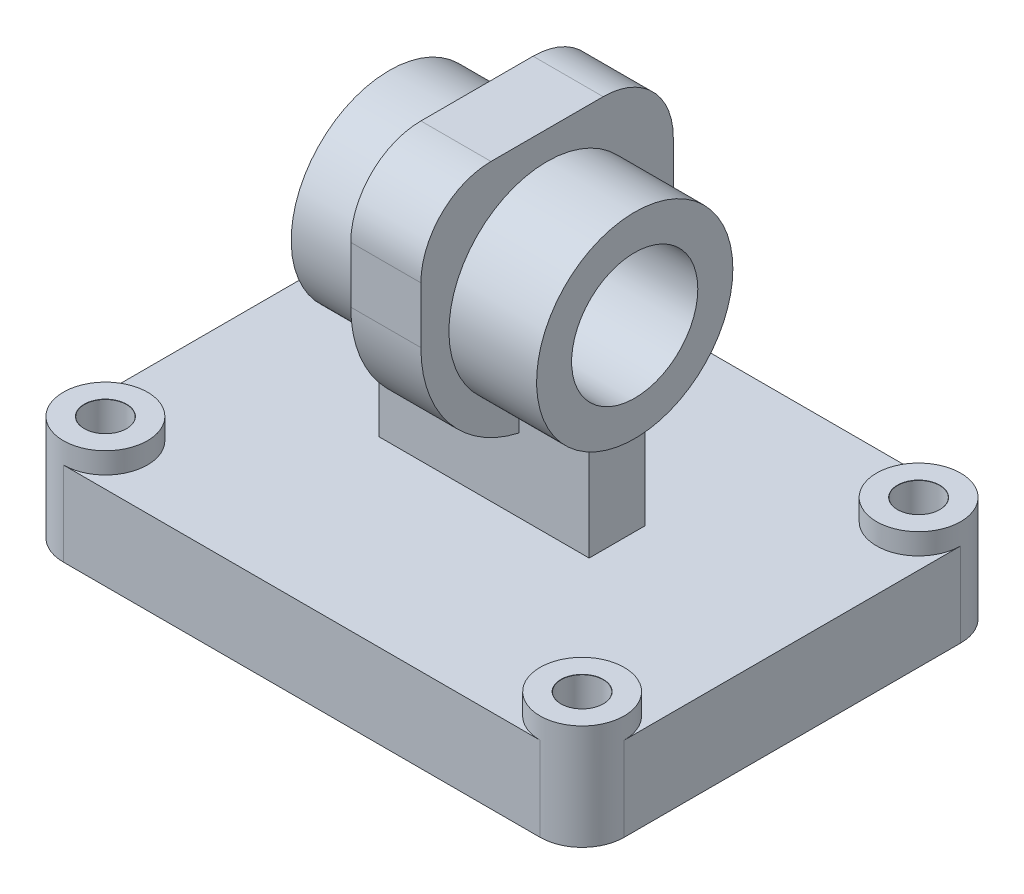
ISO-10303-21;
HEADER;
FILE_DESCRIPTION(('STEP AP214'),'2;1');
FILE_NAME('part.step','',(''),(''),'','','');
FILE_SCHEMA(('AUTOMOTIVE_DESIGN { 1 0 10303 214 1 1 1 1 }'));
ENDSEC;
DATA;
#1=APPLICATION_CONTEXT('core data for automotive mechanical design processes');
#2=APPLICATION_PROTOCOL_DEFINITION('international standard','automotive_design',2000,#1);
#3=PRODUCT_CONTEXT('',#1,'mechanical');
#4=PRODUCT('Part','Part','',(#3));
#5=PRODUCT_RELATED_PRODUCT_CATEGORY('part','',(#4));
#6=PRODUCT_DEFINITION_FORMATION('','',#4);
#7=PRODUCT_DEFINITION_CONTEXT('part definition',#1,'design');
#8=PRODUCT_DEFINITION('design','',#6,#7);
#9=PRODUCT_DEFINITION_SHAPE('','',#8);
#10=(LENGTH_UNIT() NAMED_UNIT(*) SI_UNIT(.MILLI.,.METRE.));
#11=(NAMED_UNIT(*) PLANE_ANGLE_UNIT() SI_UNIT($,.RADIAN.));
#12=(NAMED_UNIT(*) SI_UNIT($,.STERADIAN.) SOLID_ANGLE_UNIT());
#13=UNCERTAINTY_MEASURE_WITH_UNIT(LENGTH_MEASURE(1.E-05),#10,'distance_accuracy_value','');
#14=(GEOMETRIC_REPRESENTATION_CONTEXT(3) GLOBAL_UNCERTAINTY_ASSIGNED_CONTEXT((#13)) GLOBAL_UNIT_ASSIGNED_CONTEXT((#10,
#11,#12)) REPRESENTATION_CONTEXT('',''));
#15=CARTESIAN_POINT('',(0.,0.,0.));
#16=DIRECTION('',(0.,0.,1.));
#17=DIRECTION('',(1.,0.,0.));
#18=AXIS2_PLACEMENT_3D('',#15,#16,#17);
#19=CARTESIAN_POINT('',(-34.,12.,24.));
#20=DIRECTION('',(0.,1.,0.));
#21=DIRECTION('',(0.,0.,1.));
#22=AXIS2_PLACEMENT_3D('',#19,#20,#21);
#23=PLANE('',#22);
#24=DIRECTION('',(1.,0.,0.));
#25=VECTOR('',#24,1.);
#26=CARTESIAN_POINT('',(-33.9999999999999,12.,30.));
#27=LINE('',#26,#25);
#28=CARTESIAN_POINT('',(-33.9999999999999,12.,30.));
#29=VERTEX_POINT('',#28);
#30=CARTESIAN_POINT('',(34.,12.,30.));
#31=VERTEX_POINT('',#30);
#32=EDGE_CURVE('E395',#29,#31,#27,.T.);
#33=ORIENTED_EDGE('',*,*,#32,.T.);
#34=CARTESIAN_POINT('',(34.,12.,24.));
#35=DIRECTION('',(0.,1.,0.));
#36=DIRECTION('',(0.,0.,1.));
#37=AXIS2_PLACEMENT_3D('',#34,#35,#36);
#38=CIRCLE('',#37,5.99999999999999);
#39=CARTESIAN_POINT('',(40.,12.,24.));
#40=VERTEX_POINT('',#39);
#41=EDGE_CURVE('E467',#31,#40,#38,.F.);
#42=ORIENTED_EDGE('',*,*,#41,.T.);
#43=DIRECTION('',(0.,0.,-1.));
#44=VECTOR('',#43,1.);
#45=CARTESIAN_POINT('',(40.,12.,-23.9999999999999));
#46=LINE('',#45,#44);
#47=CARTESIAN_POINT('',(40.,12.,-24.));
#48=VERTEX_POINT('',#47);
#49=EDGE_CURVE('E398',#40,#48,#46,.T.);
#50=ORIENTED_EDGE('',*,*,#49,.T.);
#51=CARTESIAN_POINT('',(34.,12.,-24.));
#52=DIRECTION('',(0.,1.,0.));
#53=DIRECTION('',(0.,0.,1.));
#54=AXIS2_PLACEMENT_3D('',#51,#52,#53);
#55=CIRCLE('',#54,6.00000000000001);
#56=CARTESIAN_POINT('',(34.,12.,-30.));
#57=VERTEX_POINT('',#56);
#58=EDGE_CURVE('E393',#48,#57,#55,.F.);
#59=ORIENTED_EDGE('',*,*,#58,.T.);
#60=DIRECTION('',(-1.,0.,0.));
#61=VECTOR('',#60,1.);
#62=CARTESIAN_POINT('',(-33.9999999999999,12.,-30.));
#63=LINE('',#62,#61);
#64=CARTESIAN_POINT('',(-34.,12.,-30.));
#65=VERTEX_POINT('',#64);
#66=EDGE_CURVE('E403',#57,#65,#63,.T.);
#67=ORIENTED_EDGE('',*,*,#66,.T.);
#68=CARTESIAN_POINT('',(-34.,12.,-24.));
#69=DIRECTION('',(0.,1.,0.));
#70=DIRECTION('',(0.,0.,1.));
#71=AXIS2_PLACEMENT_3D('',#68,#69,#70);
#72=CIRCLE('',#71,6.);
#73=CARTESIAN_POINT('',(-40.,12.,-23.9999999999999));
#74=VERTEX_POINT('',#73);
#75=EDGE_CURVE('E389',#74,#65,#72,.T.);
#76=ORIENTED_EDGE('',*,*,#75,.F.);
#77=DIRECTION('',(0.,0.,1.));
#78=VECTOR('',#77,1.);
#79=CARTESIAN_POINT('',(-40.,12.,-23.9999999999999));
#80=LINE('',#79,#78);
#81=CARTESIAN_POINT('',(-40.,12.,24.));
#82=VERTEX_POINT('',#81);
#83=EDGE_CURVE('E407',#74,#82,#80,.T.);
#84=ORIENTED_EDGE('',*,*,#83,.T.);
#85=CARTESIAN_POINT('',(-34.,12.,24.));
#86=DIRECTION('',(0.,1.,0.));
#87=DIRECTION('',(0.,0.,1.));
#88=AXIS2_PLACEMENT_3D('',#85,#86,#87);
#89=CIRCLE('',#88,6.);
#90=EDGE_CURVE('E378',#29,#82,#89,.T.);
#91=ORIENTED_EDGE('',*,*,#90,.F.);
#92=EDGE_LOOP('',(#33,#42,#50,#59,#67,#76,#84,#91));
#93=FACE_BOUND('',#92,.T.);
#94=DIRECTION('',(-1.,0.,0.));
#95=VECTOR('',#94,1.);
#96=CARTESIAN_POINT('',(-15.,12.,-4.));
#97=LINE('',#96,#95);
#98=CARTESIAN_POINT('',(15.,12.,-4.));
#99=VERTEX_POINT('',#98);
#100=CARTESIAN_POINT('',(-15.,12.,-4.));
#101=VERTEX_POINT('',#100);
#102=EDGE_CURVE('E256',#99,#101,#97,.T.);
#103=ORIENTED_EDGE('',*,*,#102,.F.);
#104=DIRECTION('',(0.,0.,-1.));
#105=VECTOR('',#104,1.);
#106=CARTESIAN_POINT('',(15.,12.,-4.));
#107=LINE('',#106,#105);
#108=CARTESIAN_POINT('',(15.,12.,4.));
#109=VERTEX_POINT('',#108);
#110=EDGE_CURVE('E250',#109,#99,#107,.T.);
#111=ORIENTED_EDGE('',*,*,#110,.F.);
#112=DIRECTION('',(1.,0.,0.));
#113=VECTOR('',#112,1.);
#114=CARTESIAN_POINT('',(-15.,12.,4.));
#115=LINE('',#114,#113);
#116=CARTESIAN_POINT('',(-15.,12.,4.));
#117=VERTEX_POINT('',#116);
#118=EDGE_CURVE('E255',#117,#109,#115,.T.);
#119=ORIENTED_EDGE('',*,*,#118,.F.);
#120=DIRECTION('',(0.,0.,1.));
#121=VECTOR('',#120,1.);
#122=CARTESIAN_POINT('',(-15.,12.,-4.));
#123=LINE('',#122,#121);
#124=EDGE_CURVE('E260',#101,#117,#123,.T.);
#125=ORIENTED_EDGE('',*,*,#124,.F.);
#126=EDGE_LOOP('',(#103,#111,#119,#125));
#127=FACE_BOUND('',#126,.T.);
#128=ADVANCED_FACE('F45',(#93,#127),#23,.T.);
#129=CARTESIAN_POINT('',(-34.,12.,24.));
#130=DIRECTION('',(0.,-1.,0.));
#131=DIRECTION('',(0.,0.,-1.));
#132=AXIS2_PLACEMENT_3D('',#129,#130,#131);
#133=CYLINDRICAL_SURFACE('',#132,6.);
#134=CARTESIAN_POINT('',(-34.,0.,24.));
#135=DIRECTION('',(0.,1.,0.));
#136=DIRECTION('',(0.,0.,1.));
#137=AXIS2_PLACEMENT_3D('',#134,#135,#136);
#138=CIRCLE('',#137,6.);
#139=CARTESIAN_POINT('',(-40.,0.,24.));
#140=VERTEX_POINT('',#139);
#141=CARTESIAN_POINT('',(-33.9999999999999,0.,30.));
#142=VERTEX_POINT('',#141);
#143=EDGE_CURVE('E388',#140,#142,#138,.T.);
#144=ORIENTED_EDGE('',*,*,#143,.T.);
#145=DIRECTION('',(0.,-1.,0.));
#146=VECTOR('',#145,1.);
#147=CARTESIAN_POINT('',(-33.9999999999999,12.,30.));
#148=LINE('',#147,#146);
#149=EDGE_CURVE('E394',#29,#142,#148,.T.);
#150=ORIENTED_EDGE('',*,*,#149,.F.);
#151=ORIENTED_EDGE('',*,*,#90,.T.);
#152=DIRECTION('',(0.,-1.,0.));
#153=VECTOR('',#152,1.);
#154=CARTESIAN_POINT('',(-40.,12.,24.));
#155=LINE('',#154,#153);
#156=EDGE_CURVE('E411',#82,#140,#155,.T.);
#157=ORIENTED_EDGE('',*,*,#156,.T.);
#158=EDGE_LOOP('',(#144,#150,#151,#157));
#159=FACE_BOUND('',#158,.T.);
#160=CARTESIAN_POINT('',(-34.,15.,24.));
#161=DIRECTION('',(0.,1.,0.));
#162=DIRECTION('',(0.,0.,1.));
#163=AXIS2_PLACEMENT_3D('',#160,#161,#162);
#164=CIRCLE('',#163,6.);
#165=CARTESIAN_POINT('',(-34.,15.,30.));
#166=VERTEX_POINT('',#165);
#167=EDGE_CURVE('E377',#166,#166,#164,.T.);
#168=ORIENTED_EDGE('',*,*,#167,.F.);
#169=EDGE_LOOP('',(#168));
#170=FACE_BOUND('',#169,.T.);
#171=ADVANCED_FACE('F558',(#159,#170),#133,.T.);
#172=CARTESIAN_POINT('',(-33.9999999999999,12.,30.));
#173=DIRECTION('',(0.,0.,-1.));
#174=DIRECTION('',(-1.,0.,0.));
#175=AXIS2_PLACEMENT_3D('',#172,#173,#174);
#176=PLANE('',#175);
#177=DIRECTION('',(1.,0.,0.));
#178=VECTOR('',#177,1.);
#179=CARTESIAN_POINT('',(-33.9999999999999,0.,30.));
#180=LINE('',#179,#178);
#181=CARTESIAN_POINT('',(34.,0.,30.));
#182=VERTEX_POINT('',#181);
#183=EDGE_CURVE('E415',#142,#182,#180,.T.);
#184=ORIENTED_EDGE('',*,*,#183,.T.);
#185=DIRECTION('',(0.,-1.,0.));
#186=VECTOR('',#185,1.);
#187=CARTESIAN_POINT('',(34.,12.,30.));
#188=LINE('',#187,#186);
#189=EDGE_CURVE('E458',#31,#182,#188,.T.);
#190=ORIENTED_EDGE('',*,*,#189,.F.);
#191=ORIENTED_EDGE('',*,*,#32,.F.);
#192=ORIENTED_EDGE('',*,*,#149,.T.);
#193=EDGE_LOOP('',(#184,#190,#191,#192));
#194=FACE_BOUND('',#193,.T.);
#195=ADVANCED_FACE('F564',(#194),#176,.F.);
#196=CARTESIAN_POINT('',(34.,12.,24.));
#197=DIRECTION('',(0.,-1.,0.));
#198=DIRECTION('',(0.,0.,-1.));
#199=AXIS2_PLACEMENT_3D('',#196,#197,#198);
#200=CYLINDRICAL_SURFACE('',#199,6.);
#201=CARTESIAN_POINT('',(34.,0.,24.));
#202=DIRECTION('',(0.,1.,0.));
#203=DIRECTION('',(0.,0.,1.));
#204=AXIS2_PLACEMENT_3D('',#201,#202,#203);
#205=CIRCLE('',#204,6.);
#206=CARTESIAN_POINT('',(40.,0.,24.));
#207=VERTEX_POINT('',#206);
#208=EDGE_CURVE('E418',#182,#207,#205,.T.);
#209=ORIENTED_EDGE('',*,*,#208,.T.);
#210=DIRECTION('',(0.,-1.,0.));
#211=VECTOR('',#210,1.);
#212=CARTESIAN_POINT('',(40.,12.,24.));
#213=LINE('',#212,#211);
#214=EDGE_CURVE('E454',#40,#207,#213,.T.);
#215=ORIENTED_EDGE('',*,*,#214,.F.);
#216=ORIENTED_EDGE('',*,*,#41,.F.);
#217=ORIENTED_EDGE('',*,*,#189,.T.);
#218=EDGE_LOOP('',(#209,#215,#216,#217));
#219=FACE_BOUND('',#218,.T.);
#220=CARTESIAN_POINT('',(34.,15.,24.));
#221=DIRECTION('',(0.,1.,0.));
#222=DIRECTION('',(0.,0.,1.));
#223=AXIS2_PLACEMENT_3D('',#220,#221,#222);
#224=CIRCLE('',#223,5.99999999999999);
#225=CARTESIAN_POINT('',(34.,15.,30.));
#226=VERTEX_POINT('',#225);
#227=EDGE_CURVE('E369',#226,#226,#224,.T.);
#228=ORIENTED_EDGE('',*,*,#227,.F.);
#229=EDGE_LOOP('',(#228));
#230=FACE_BOUND('',#229,.T.);
#231=ADVANCED_FACE('F594',(#219,#230),#200,.T.);
#232=CARTESIAN_POINT('',(40.,12.,-23.9999999999999));
#233=DIRECTION('',(-1.,0.,0.));
#234=DIRECTION('',(0.,0.,1.));
#235=AXIS2_PLACEMENT_3D('',#232,#233,#234);
#236=PLANE('',#235);
#237=DIRECTION('',(0.,0.,-1.));
#238=VECTOR('',#237,1.);
#239=CARTESIAN_POINT('',(40.,0.,-23.9999999999999));
#240=LINE('',#239,#238);
#241=CARTESIAN_POINT('',(40.,0.,-23.9999999999999));
#242=VERTEX_POINT('',#241);
#243=EDGE_CURVE('E421',#207,#242,#240,.T.);
#244=ORIENTED_EDGE('',*,*,#243,.T.);
#245=DIRECTION('',(0.,-1.,0.));
#246=VECTOR('',#245,1.);
#247=CARTESIAN_POINT('',(40.,12.,-23.9999999999999));
#248=LINE('',#247,#246);
#249=EDGE_CURVE('E450',#48,#242,#248,.T.);
#250=ORIENTED_EDGE('',*,*,#249,.F.);
#251=ORIENTED_EDGE('',*,*,#49,.F.);
#252=ORIENTED_EDGE('',*,*,#214,.T.);
#253=EDGE_LOOP('',(#244,#250,#251,#252));
#254=FACE_BOUND('',#253,.T.);
#255=ADVANCED_FACE('F590',(#254),#236,.F.);
#256=CARTESIAN_POINT('',(34.,12.,-24.));
#257=DIRECTION('',(0.,-1.,0.));
#258=DIRECTION('',(0.,0.,-1.));
#259=AXIS2_PLACEMENT_3D('',#256,#257,#258);
#260=CYLINDRICAL_SURFACE('',#259,6.);
#261=CARTESIAN_POINT('',(34.,0.,-24.));
#262=DIRECTION('',(0.,1.,0.));
#263=DIRECTION('',(0.,0.,-1.));
#264=AXIS2_PLACEMENT_3D('',#261,#262,#263);
#265=CIRCLE('',#264,6.);
#266=CARTESIAN_POINT('',(34.,0.,-30.));
#267=VERTEX_POINT('',#266);
#268=EDGE_CURVE('E424',#242,#267,#265,.T.);
#269=ORIENTED_EDGE('',*,*,#268,.T.);
#270=DIRECTION('',(0.,-1.,0.));
#271=VECTOR('',#270,1.);
#272=CARTESIAN_POINT('',(34.,12.,-30.));
#273=LINE('',#272,#271);
#274=EDGE_CURVE('E446',#57,#267,#273,.T.);
#275=ORIENTED_EDGE('',*,*,#274,.F.);
#276=ORIENTED_EDGE('',*,*,#58,.F.);
#277=ORIENTED_EDGE('',*,*,#249,.T.);
#278=EDGE_LOOP('',(#269,#275,#276,#277));
#279=FACE_BOUND('',#278,.T.);
#280=CARTESIAN_POINT('',(34.,15.,-24.));
#281=DIRECTION('',(0.,1.,0.));
#282=DIRECTION('',(0.,0.,1.));
#283=AXIS2_PLACEMENT_3D('',#280,#281,#282);
#284=CIRCLE('',#283,6.00000000000001);
#285=CARTESIAN_POINT('',(34.,15.,-18.));
#286=VERTEX_POINT('',#285);
#287=EDGE_CURVE('E373',#286,#286,#284,.T.);
#288=ORIENTED_EDGE('',*,*,#287,.F.);
#289=EDGE_LOOP('',(#288));
#290=FACE_BOUND('',#289,.T.);
#291=ADVANCED_FACE('F586',(#279,#290),#260,.T.);
#292=CARTESIAN_POINT('',(-33.9999999999999,12.,-30.));
#293=DIRECTION('',(0.,0.,1.));
#294=DIRECTION('',(1.,0.,0.));
#295=AXIS2_PLACEMENT_3D('',#292,#293,#294);
#296=PLANE('',#295);
#297=DIRECTION('',(-1.,0.,0.));
#298=VECTOR('',#297,1.);
#299=CARTESIAN_POINT('',(-33.9999999999999,0.,-30.));
#300=LINE('',#299,#298);
#301=CARTESIAN_POINT('',(-33.9999999999999,0.,-30.));
#302=VERTEX_POINT('',#301);
#303=EDGE_CURVE('E427',#267,#302,#300,.T.);
#304=ORIENTED_EDGE('',*,*,#303,.T.);
#305=DIRECTION('',(0.,-1.,0.));
#306=VECTOR('',#305,1.);
#307=CARTESIAN_POINT('',(-33.9999999999999,12.,-30.));
#308=LINE('',#307,#306);
#309=EDGE_CURVE('E442',#65,#302,#308,.T.);
#310=ORIENTED_EDGE('',*,*,#309,.F.);
#311=ORIENTED_EDGE('',*,*,#66,.F.);
#312=ORIENTED_EDGE('',*,*,#274,.T.);
#313=EDGE_LOOP('',(#304,#310,#311,#312));
#314=FACE_BOUND('',#313,.T.);
#315=ADVANCED_FACE('F582',(#314),#296,.F.);
#316=CARTESIAN_POINT('',(-34.,12.,-24.));
#317=DIRECTION('',(0.,-1.,0.));
#318=DIRECTION('',(0.,0.,-1.));
#319=AXIS2_PLACEMENT_3D('',#316,#317,#318);
#320=CYLINDRICAL_SURFACE('',#319,6.);
#321=CARTESIAN_POINT('',(-34.,0.,-24.));
#322=DIRECTION('',(0.,1.,0.));
#323=DIRECTION('',(0.,0.,1.));
#324=AXIS2_PLACEMENT_3D('',#321,#322,#323);
#325=CIRCLE('',#324,6.);
#326=CARTESIAN_POINT('',(-40.,0.,-23.9999999999999));
#327=VERTEX_POINT('',#326);
#328=EDGE_CURVE('E430',#302,#327,#325,.T.);
#329=ORIENTED_EDGE('',*,*,#328,.T.);
#330=DIRECTION('',(0.,-1.,0.));
#331=VECTOR('',#330,1.);
#332=CARTESIAN_POINT('',(-40.,12.,-23.9999999999999));
#333=LINE('',#332,#331);
#334=EDGE_CURVE('E438',#74,#327,#333,.T.);
#335=ORIENTED_EDGE('',*,*,#334,.F.);
#336=ORIENTED_EDGE('',*,*,#75,.T.);
#337=ORIENTED_EDGE('',*,*,#309,.T.);
#338=EDGE_LOOP('',(#329,#335,#336,#337));
#339=FACE_BOUND('',#338,.T.);
#340=CARTESIAN_POINT('',(-34.,15.,-24.));
#341=DIRECTION('',(0.,1.,0.));
#342=DIRECTION('',(0.,0.,1.));
#343=AXIS2_PLACEMENT_3D('',#340,#341,#342);
#344=CIRCLE('',#343,6.);
#345=CARTESIAN_POINT('',(-34.,15.,-18.));
#346=VERTEX_POINT('',#345);
#347=EDGE_CURVE('E381',#346,#346,#344,.T.);
#348=ORIENTED_EDGE('',*,*,#347,.F.);
#349=EDGE_LOOP('',(#348));
#350=FACE_BOUND('',#349,.T.);
#351=ADVANCED_FACE('F578',(#339,#350),#320,.T.);
#352=CARTESIAN_POINT('',(-40.,12.,-23.9999999999999));
#353=DIRECTION('',(1.,0.,0.));
#354=DIRECTION('',(0.,0.,-1.));
#355=AXIS2_PLACEMENT_3D('',#352,#353,#354);
#356=PLANE('',#355);
#357=DIRECTION('',(0.,0.,1.));
#358=VECTOR('',#357,1.);
#359=CARTESIAN_POINT('',(-40.,0.,-23.9999999999999));
#360=LINE('',#359,#358);
#361=EDGE_CURVE('E399',#327,#140,#360,.T.);
#362=ORIENTED_EDGE('',*,*,#361,.T.);
#363=ORIENTED_EDGE('',*,*,#156,.F.);
#364=ORIENTED_EDGE('',*,*,#83,.F.);
#365=ORIENTED_EDGE('',*,*,#334,.T.);
#366=EDGE_LOOP('',(#362,#363,#364,#365));
#367=FACE_BOUND('',#366,.T.);
#368=ADVANCED_FACE('F574',(#367),#356,.F.);
#369=CARTESIAN_POINT('',(-34.,0.,24.));
#370=DIRECTION('',(0.,1.,0.));
#371=DIRECTION('',(0.,0.,1.));
#372=AXIS2_PLACEMENT_3D('',#369,#370,#371);
#373=PLANE('',#372);
#374=CARTESIAN_POINT('',(-34.,0.,-24.));
#375=DIRECTION('',(0.,1.,0.));
#376=DIRECTION('',(0.,0.,1.));
#377=AXIS2_PLACEMENT_3D('',#374,#375,#376);
#378=CIRCLE('',#377,3.);
#379=CARTESIAN_POINT('',(-34.,0.,-21.));
#380=VERTEX_POINT('',#379);
#381=EDGE_CURVE('E329',#380,#380,#378,.T.);
#382=ORIENTED_EDGE('',*,*,#381,.T.);
#383=EDGE_LOOP('',(#382));
#384=FACE_BOUND('',#383,.T.);
#385=CARTESIAN_POINT('',(34.,0.,-24.));
#386=DIRECTION('',(0.,1.,0.));
#387=DIRECTION('',(0.,0.,1.));
#388=AXIS2_PLACEMENT_3D('',#385,#386,#387);
#389=CIRCLE('',#388,3.);
#390=CARTESIAN_POINT('',(34.,0.,-21.));
#391=VERTEX_POINT('',#390);
#392=EDGE_CURVE('E341',#391,#391,#389,.T.);
#393=ORIENTED_EDGE('',*,*,#392,.T.);
#394=EDGE_LOOP('',(#393));
#395=FACE_BOUND('',#394,.T.);
#396=CARTESIAN_POINT('',(34.,0.,24.));
#397=DIRECTION('',(0.,1.,0.));
#398=DIRECTION('',(0.,0.,1.));
#399=AXIS2_PLACEMENT_3D('',#396,#397,#398);
#400=CIRCLE('',#399,3.);
#401=CARTESIAN_POINT('',(34.,0.,27.));
#402=VERTEX_POINT('',#401);
#403=EDGE_CURVE('E353',#402,#402,#400,.T.);
#404=ORIENTED_EDGE('',*,*,#403,.T.);
#405=EDGE_LOOP('',(#404));
#406=FACE_BOUND('',#405,.T.);
#407=CARTESIAN_POINT('',(-34.,0.,24.));
#408=DIRECTION('',(0.,1.,0.));
#409=DIRECTION('',(0.,0.,1.));
#410=AXIS2_PLACEMENT_3D('',#407,#408,#409);
#411=CIRCLE('',#410,3.);
#412=CARTESIAN_POINT('',(-34.,0.,27.));
#413=VERTEX_POINT('',#412);
#414=EDGE_CURVE('E365',#413,#413,#411,.T.);
#415=ORIENTED_EDGE('',*,*,#414,.T.);
#416=EDGE_LOOP('',(#415));
#417=FACE_BOUND('',#416,.T.);
#418=ORIENTED_EDGE('',*,*,#143,.F.);
#419=ORIENTED_EDGE('',*,*,#361,.F.);
#420=ORIENTED_EDGE('',*,*,#328,.F.);
#421=ORIENTED_EDGE('',*,*,#303,.F.);
#422=ORIENTED_EDGE('',*,*,#268,.F.);
#423=ORIENTED_EDGE('',*,*,#243,.F.);
#424=ORIENTED_EDGE('',*,*,#208,.F.);
#425=ORIENTED_EDGE('',*,*,#183,.F.);
#426=EDGE_LOOP('',(#418,#419,#420,#421,#422,#423,#424,#425));
#427=FACE_BOUND('',#426,.T.);
#428=ADVANCED_FACE('F571',(#384,#395,#406,#417,#427),#373,.F.);
#429=CARTESIAN_POINT('',(-34.,15.,-24.));
#430=DIRECTION('',(0.,1.,0.));
#431=DIRECTION('',(0.,0.,1.));
#432=AXIS2_PLACEMENT_3D('',#429,#430,#431);
#433=PLANE('',#432);
#434=CARTESIAN_POINT('',(-34.,15.,-24.));
#435=DIRECTION('',(0.,1.,0.));
#436=DIRECTION('',(0.,0.,1.));
#437=AXIS2_PLACEMENT_3D('',#434,#435,#436);
#438=CIRCLE('',#437,3.025);
#439=CARTESIAN_POINT('',(-34.,15.,-20.975));
#440=VERTEX_POINT('',#439);
#441=EDGE_CURVE('E254',#440,#440,#438,.T.);
#442=ORIENTED_EDGE('',*,*,#441,.F.);
#443=EDGE_LOOP('',(#442));
#444=FACE_BOUND('',#443,.T.);
#445=ORIENTED_EDGE('',*,*,#347,.T.);
#446=EDGE_LOOP('',(#445));
#447=FACE_BOUND('',#446,.T.);
#448=ADVANCED_FACE('F569',(#444,#447),#433,.T.);
#449=CARTESIAN_POINT('',(-34.,15.,24.));
#450=DIRECTION('',(0.,1.,0.));
#451=DIRECTION('',(0.,0.,1.));
#452=AXIS2_PLACEMENT_3D('',#449,#450,#451);
#453=PLANE('',#452);
#454=CARTESIAN_POINT('',(-34.,15.,24.));
#455=DIRECTION('',(0.,1.,0.));
#456=DIRECTION('',(0.,0.,1.));
#457=AXIS2_PLACEMENT_3D('',#454,#455,#456);
#458=CIRCLE('',#457,3.025);
#459=CARTESIAN_POINT('',(-34.,15.,27.025));
#460=VERTEX_POINT('',#459);
#461=EDGE_CURVE('E357',#460,#460,#458,.T.);
#462=ORIENTED_EDGE('',*,*,#461,.F.);
#463=EDGE_LOOP('',(#462));
#464=FACE_BOUND('',#463,.T.);
#465=ORIENTED_EDGE('',*,*,#167,.T.);
#466=EDGE_LOOP('',(#465));
#467=FACE_BOUND('',#466,.T.);
#468=ADVANCED_FACE('F629',(#464,#467),#453,.T.);
#469=CARTESIAN_POINT('',(34.,15.,-24.));
#470=DIRECTION('',(0.,1.,0.));
#471=DIRECTION('',(0.,0.,1.));
#472=AXIS2_PLACEMENT_3D('',#469,#470,#471);
#473=PLANE('',#472);
#474=CARTESIAN_POINT('',(34.,15.,-24.));
#475=DIRECTION('',(0.,1.,0.));
#476=DIRECTION('',(0.,0.,1.));
#477=AXIS2_PLACEMENT_3D('',#474,#475,#476);
#478=CIRCLE('',#477,3.025);
#479=CARTESIAN_POINT('',(34.,15.,-20.975));
#480=VERTEX_POINT('',#479);
#481=EDGE_CURVE('E333',#480,#480,#478,.T.);
#482=ORIENTED_EDGE('',*,*,#481,.F.);
#483=EDGE_LOOP('',(#482));
#484=FACE_BOUND('',#483,.T.);
#485=ORIENTED_EDGE('',*,*,#287,.T.);
#486=EDGE_LOOP('',(#485));
#487=FACE_BOUND('',#486,.T.);
#488=ADVANCED_FACE('F634',(#484,#487),#473,.T.);
#489=CARTESIAN_POINT('',(34.,15.,24.));
#490=DIRECTION('',(0.,1.,0.));
#491=DIRECTION('',(0.,0.,1.));
#492=AXIS2_PLACEMENT_3D('',#489,#490,#491);
#493=PLANE('',#492);
#494=CARTESIAN_POINT('',(34.,15.,24.));
#495=DIRECTION('',(0.,1.,0.));
#496=DIRECTION('',(0.,0.,1.));
#497=AXIS2_PLACEMENT_3D('',#494,#495,#496);
#498=CIRCLE('',#497,3.025);
#499=CARTESIAN_POINT('',(34.,15.,27.025));
#500=VERTEX_POINT('',#499);
#501=EDGE_CURVE('E345',#500,#500,#498,.T.);
#502=ORIENTED_EDGE('',*,*,#501,.F.);
#503=EDGE_LOOP('',(#502));
#504=FACE_BOUND('',#503,.T.);
#505=ORIENTED_EDGE('',*,*,#227,.T.);
#506=EDGE_LOOP('',(#505));
#507=FACE_BOUND('',#506,.T.);
#508=ADVANCED_FACE('F815',(#504,#507),#493,.T.);
#509=CARTESIAN_POINT('',(-34.,15.,24.));
#510=DIRECTION('',(0.,1.,0.));
#511=DIRECTION('',(0.,0.,1.));
#512=AXIS2_PLACEMENT_3D('',#509,#510,#511);
#513=CYLINDRICAL_SURFACE('',#512,2.99999999999999);
#514=ORIENTED_EDGE('',*,*,#414,.F.);
#515=EDGE_LOOP('',(#514));
#516=FACE_BOUND('',#515,.T.);
#517=CARTESIAN_POINT('',(-34.,14.975,24.));
#518=DIRECTION('',(0.,1.,0.));
#519=DIRECTION('',(0.,0.,1.));
#520=AXIS2_PLACEMENT_3D('',#517,#518,#519);
#521=CIRCLE('',#520,2.99999999999999);
#522=CARTESIAN_POINT('',(-34.,14.975,27.));
#523=VERTEX_POINT('',#522);
#524=EDGE_CURVE('E361',#523,#523,#521,.T.);
#525=ORIENTED_EDGE('',*,*,#524,.T.);
#526=EDGE_LOOP('',(#525));
#527=FACE_BOUND('',#526,.T.);
#528=ADVANCED_FACE('F804',(#516,#527),#513,.F.);
#529=CARTESIAN_POINT('',(-34.,15.,24.));
#530=DIRECTION('',(0.,1.,0.));
#531=DIRECTION('',(0.,0.,1.));
#532=AXIS2_PLACEMENT_3D('',#529,#530,#531);
#533=CONICAL_SURFACE('',#532,3.025,0.785398163397136);
#534=ORIENTED_EDGE('',*,*,#524,.F.);
#535=EDGE_LOOP('',(#534));
#536=FACE_BOUND('',#535,.T.);
#537=ORIENTED_EDGE('',*,*,#461,.T.);
#538=EDGE_LOOP('',(#537));
#539=FACE_BOUND('',#538,.T.);
#540=ADVANCED_FACE('F792',(#536,#539),#533,.F.);
#541=CARTESIAN_POINT('',(34.,15.,24.));
#542=DIRECTION('',(0.,1.,0.));
#543=DIRECTION('',(0.,0.,1.));
#544=AXIS2_PLACEMENT_3D('',#541,#542,#543);
#545=CYLINDRICAL_SURFACE('',#544,2.99999999999999);
#546=ORIENTED_EDGE('',*,*,#403,.F.);
#547=EDGE_LOOP('',(#546));
#548=FACE_BOUND('',#547,.T.);
#549=CARTESIAN_POINT('',(34.,14.975,24.));
#550=DIRECTION('',(0.,1.,0.));
#551=DIRECTION('',(0.,0.,1.));
#552=AXIS2_PLACEMENT_3D('',#549,#550,#551);
#553=CIRCLE('',#552,2.99999999999999);
#554=CARTESIAN_POINT('',(34.,14.975,27.));
#555=VERTEX_POINT('',#554);
#556=EDGE_CURVE('E349',#555,#555,#553,.T.);
#557=ORIENTED_EDGE('',*,*,#556,.T.);
#558=EDGE_LOOP('',(#557));
#559=FACE_BOUND('',#558,.T.);
#560=ADVANCED_FACE('F781',(#548,#559),#545,.F.);
#561=CARTESIAN_POINT('',(34.,15.,24.));
#562=DIRECTION('',(0.,1.,0.));
#563=DIRECTION('',(0.,0.,1.));
#564=AXIS2_PLACEMENT_3D('',#561,#562,#563);
#565=CONICAL_SURFACE('',#564,3.025,0.785398163397136);
#566=ORIENTED_EDGE('',*,*,#556,.F.);
#567=EDGE_LOOP('',(#566));
#568=FACE_BOUND('',#567,.T.);
#569=ORIENTED_EDGE('',*,*,#501,.T.);
#570=EDGE_LOOP('',(#569));
#571=FACE_BOUND('',#570,.T.);
#572=ADVANCED_FACE('F769',(#568,#571),#565,.F.);
#573=CARTESIAN_POINT('',(34.,15.,-24.));
#574=DIRECTION('',(0.,1.,0.));
#575=DIRECTION('',(0.,0.,1.));
#576=AXIS2_PLACEMENT_3D('',#573,#574,#575);
#577=CYLINDRICAL_SURFACE('',#576,2.99999999999999);
#578=ORIENTED_EDGE('',*,*,#392,.F.);
#579=EDGE_LOOP('',(#578));
#580=FACE_BOUND('',#579,.T.);
#581=CARTESIAN_POINT('',(34.,14.975,-24.));
#582=DIRECTION('',(0.,1.,0.));
#583=DIRECTION('',(0.,0.,1.));
#584=AXIS2_PLACEMENT_3D('',#581,#582,#583);
#585=CIRCLE('',#584,2.99999999999999);
#586=CARTESIAN_POINT('',(34.,14.975,-21.));
#587=VERTEX_POINT('',#586);
#588=EDGE_CURVE('E337',#587,#587,#585,.T.);
#589=ORIENTED_EDGE('',*,*,#588,.T.);
#590=EDGE_LOOP('',(#589));
#591=FACE_BOUND('',#590,.T.);
#592=ADVANCED_FACE('F757',(#580,#591),#577,.F.);
#593=CARTESIAN_POINT('',(34.,15.,-24.));
#594=DIRECTION('',(0.,1.,0.));
#595=DIRECTION('',(0.,0.,1.));
#596=AXIS2_PLACEMENT_3D('',#593,#594,#595);
#597=CONICAL_SURFACE('',#596,3.025,0.785398163397136);
#598=ORIENTED_EDGE('',*,*,#588,.F.);
#599=EDGE_LOOP('',(#598));
#600=FACE_BOUND('',#599,.T.);
#601=ORIENTED_EDGE('',*,*,#481,.T.);
#602=EDGE_LOOP('',(#601));
#603=FACE_BOUND('',#602,.T.);
#604=ADVANCED_FACE('F648',(#600,#603),#597,.F.);
#605=CARTESIAN_POINT('',(-34.,15.,-24.));
#606=DIRECTION('',(0.,1.,0.));
#607=DIRECTION('',(0.,0.,1.));
#608=AXIS2_PLACEMENT_3D('',#605,#606,#607);
#609=CYLINDRICAL_SURFACE('',#608,2.99999999999999);
#610=ORIENTED_EDGE('',*,*,#381,.F.);
#611=EDGE_LOOP('',(#610));
#612=FACE_BOUND('',#611,.T.);
#613=CARTESIAN_POINT('',(-34.,14.975,-24.));
#614=DIRECTION('',(0.,1.,0.));
#615=DIRECTION('',(0.,0.,1.));
#616=AXIS2_PLACEMENT_3D('',#613,#614,#615);
#617=CIRCLE('',#616,2.99999999999999);
#618=CARTESIAN_POINT('',(-34.,14.975,-21.));
#619=VERTEX_POINT('',#618);
#620=EDGE_CURVE('E325',#619,#619,#617,.T.);
#621=ORIENTED_EDGE('',*,*,#620,.T.);
#622=EDGE_LOOP('',(#621));
#623=FACE_BOUND('',#622,.T.);
#624=ADVANCED_FACE('F640',(#612,#623),#609,.F.);
#625=CARTESIAN_POINT('',(-34.,15.,-24.));
#626=DIRECTION('',(0.,1.,0.));
#627=DIRECTION('',(0.,0.,1.));
#628=AXIS2_PLACEMENT_3D('',#625,#626,#627);
#629=CONICAL_SURFACE('',#628,3.025,0.785398163397136);
#630=ORIENTED_EDGE('',*,*,#620,.F.);
#631=EDGE_LOOP('',(#630));
#632=FACE_BOUND('',#631,.T.);
#633=ORIENTED_EDGE('',*,*,#441,.T.);
#634=EDGE_LOOP('',(#633));
#635=FACE_BOUND('',#634,.T.);
#636=ADVANCED_FACE('F638',(#632,#635),#629,.F.);
#637=CARTESIAN_POINT('',(15.,58.002,-4.));
#638=DIRECTION('',(-1.,0.,0.));
#639=DIRECTION('',(0.,0.,1.));
#640=AXIS2_PLACEMENT_3D('',#637,#638,#639);
#641=PLANE('',#640);
#642=CARTESIAN_POINT('',(15.,40.,0.));
#643=DIRECTION('',(-1.,0.,0.));
#644=DIRECTION('',(0.,0.,1.));
#645=AXIS2_PLACEMENT_3D('',#642,#643,#644);
#646=CIRCLE('',#645,14.);
#647=CARTESIAN_POINT('',(15.,26.5835921350013,4.));
#648=VERTEX_POINT('',#647);
#649=CARTESIAN_POINT('',(15.,26.5835921350013,-4.));
#650=VERTEX_POINT('',#649);
#651=EDGE_CURVE('E284',#648,#650,#646,.F.);
#652=ORIENTED_EDGE('',*,*,#651,.F.);
#653=DIRECTION('',(0.,-1.,0.));
#654=VECTOR('',#653,1.);
#655=CARTESIAN_POINT('',(15.,58.002,4.));
#656=LINE('',#655,#654);
#657=EDGE_CURVE('E261',#648,#109,#656,.T.);
#658=ORIENTED_EDGE('',*,*,#657,.T.);
#659=ORIENTED_EDGE('',*,*,#110,.T.);
#660=DIRECTION('',(0.,-1.,0.));
#661=VECTOR('',#660,1.);
#662=CARTESIAN_POINT('',(15.,58.002,-4.));
#663=LINE('',#662,#661);
#664=EDGE_CURVE('E276',#650,#99,#663,.T.);
#665=ORIENTED_EDGE('',*,*,#664,.F.);
#666=EDGE_LOOP('',(#652,#658,#659,#665));
#667=FACE_BOUND('',#666,.T.);
#668=ADVANCED_FACE('F547',(#667),#641,.F.);
#669=CARTESIAN_POINT('',(-15.,58.002,-4.));
#670=DIRECTION('',(0.,0.,1.));
#671=DIRECTION('',(1.,0.,0.));
#672=AXIS2_PLACEMENT_3D('',#669,#670,#671);
#673=PLANE('',#672);
#674=DIRECTION('',(-1.,0.,0.));
#675=VECTOR('',#674,1.);
#676=CARTESIAN_POINT('',(17.5,26.5835921350013,-4.));
#677=LINE('',#676,#675);
#678=CARTESIAN_POINT('',(-5.,26.5835921350013,-4.));
#679=VERTEX_POINT('',#678);
#680=CARTESIAN_POINT('',(-15.,26.5835921350013,-4.));
#681=VERTEX_POINT('',#680);
#682=EDGE_CURVE('E289',#679,#681,#677,.T.);
#683=ORIENTED_EDGE('',*,*,#682,.F.);
#684=DIRECTION('',(0.,1.,0.));
#685=VECTOR('',#684,1.);
#686=CARTESIAN_POINT('',(-5.,58.002,-4.));
#687=LINE('',#686,#685);
#688=CARTESIAN_POINT('',(-5.,22.4500712252158,-4.));
#689=VERTEX_POINT('',#688);
#690=EDGE_CURVE('E285',#689,#679,#687,.T.);
#691=ORIENTED_EDGE('',*,*,#690,.F.);
#692=DIRECTION('',(-1.,0.,0.));
#693=VECTOR('',#692,1.);
#694=CARTESIAN_POINT('',(5.,22.4500712252158,-4.));
#695=LINE('',#694,#693);
#696=CARTESIAN_POINT('',(5.,22.4500712252158,-4.));
#697=VERTEX_POINT('',#696);
#698=EDGE_CURVE('E290',#697,#689,#695,.T.);
#699=ORIENTED_EDGE('',*,*,#698,.F.);
#700=DIRECTION('',(0.,1.,0.));
#701=VECTOR('',#700,1.);
#702=CARTESIAN_POINT('',(5.,58.002,-4.));
#703=LINE('',#702,#701);
#704=CARTESIAN_POINT('',(5.,26.5835921350013,-4.));
#705=VERTEX_POINT('',#704);
#706=EDGE_CURVE('E206',#697,#705,#703,.T.);
#707=ORIENTED_EDGE('',*,*,#706,.T.);
#708=DIRECTION('',(-1.,0.,0.));
#709=VECTOR('',#708,1.);
#710=CARTESIAN_POINT('',(17.5,26.5835921350013,-4.));
#711=LINE('',#710,#709);
#712=EDGE_CURVE('E299',#650,#705,#711,.T.);
#713=ORIENTED_EDGE('',*,*,#712,.F.);
#714=ORIENTED_EDGE('',*,*,#664,.T.);
#715=ORIENTED_EDGE('',*,*,#102,.T.);
#716=DIRECTION('',(0.,-1.,0.));
#717=VECTOR('',#716,1.);
#718=CARTESIAN_POINT('',(-15.,58.002,-4.));
#719=LINE('',#718,#717);
#720=EDGE_CURVE('E273',#681,#101,#719,.T.);
#721=ORIENTED_EDGE('',*,*,#720,.F.);
#722=EDGE_LOOP('',(#683,#691,#699,#707,#713,#714,#715,#721));
#723=FACE_BOUND('',#722,.T.);
#724=ADVANCED_FACE('F538',(#723),#673,.F.);
#725=CARTESIAN_POINT('',(-15.,58.002,-4.));
#726=DIRECTION('',(1.,0.,0.));
#727=DIRECTION('',(0.,0.,-1.));
#728=AXIS2_PLACEMENT_3D('',#725,#726,#727);
#729=PLANE('',#728);
#730=CARTESIAN_POINT('',(-15.,40.,0.));
#731=DIRECTION('',(1.,0.,0.));
#732=DIRECTION('',(0.,0.,-1.));
#733=AXIS2_PLACEMENT_3D('',#730,#731,#732);
#734=CIRCLE('',#733,14.);
#735=CARTESIAN_POINT('',(-15.,26.5835921350013,4.));
#736=VERTEX_POINT('',#735);
#737=EDGE_CURVE('E303',#681,#736,#734,.F.);
#738=ORIENTED_EDGE('',*,*,#737,.F.);
#739=ORIENTED_EDGE('',*,*,#720,.T.);
#740=ORIENTED_EDGE('',*,*,#124,.T.);
#741=DIRECTION('',(0.,-1.,0.));
#742=VECTOR('',#741,1.);
#743=CARTESIAN_POINT('',(-15.,58.002,4.));
#744=LINE('',#743,#742);
#745=EDGE_CURVE('E269',#736,#117,#744,.T.);
#746=ORIENTED_EDGE('',*,*,#745,.F.);
#747=EDGE_LOOP('',(#738,#739,#740,#746));
#748=FACE_BOUND('',#747,.T.);
#749=ADVANCED_FACE('F536',(#748),#729,.F.);
#750=CARTESIAN_POINT('',(-15.,58.002,4.));
#751=DIRECTION('',(0.,0.,-1.));
#752=DIRECTION('',(-1.,0.,0.));
#753=AXIS2_PLACEMENT_3D('',#750,#751,#752);
#754=PLANE('',#753);
#755=DIRECTION('',(-1.,0.,0.));
#756=VECTOR('',#755,1.);
#757=CARTESIAN_POINT('',(17.5,26.5835921350013,4.));
#758=LINE('',#757,#756);
#759=CARTESIAN_POINT('',(-5.,26.5835921350013,4.));
#760=VERTEX_POINT('',#759);
#761=EDGE_CURVE('E307',#736,#760,#758,.F.);
#762=ORIENTED_EDGE('',*,*,#761,.F.);
#763=ORIENTED_EDGE('',*,*,#745,.T.);
#764=ORIENTED_EDGE('',*,*,#118,.T.);
#765=ORIENTED_EDGE('',*,*,#657,.F.);
#766=DIRECTION('',(-1.,0.,0.));
#767=VECTOR('',#766,1.);
#768=CARTESIAN_POINT('',(17.5,26.5835921350013,4.));
#769=LINE('',#768,#767);
#770=CARTESIAN_POINT('',(5.,26.5835921350013,4.));
#771=VERTEX_POINT('',#770);
#772=EDGE_CURVE('E230',#771,#648,#769,.F.);
#773=ORIENTED_EDGE('',*,*,#772,.F.);
#774=DIRECTION('',(0.,-1.,0.));
#775=VECTOR('',#774,1.);
#776=CARTESIAN_POINT('',(5.,58.002,4.));
#777=LINE('',#776,#775);
#778=CARTESIAN_POINT('',(5.,22.4500712252158,4.));
#779=VERTEX_POINT('',#778);
#780=EDGE_CURVE('E279',#771,#779,#777,.T.);
#781=ORIENTED_EDGE('',*,*,#780,.T.);
#782=DIRECTION('',(-1.,0.,0.));
#783=VECTOR('',#782,1.);
#784=CARTESIAN_POINT('',(5.,22.4500712252158,4.));
#785=LINE('',#784,#783);
#786=CARTESIAN_POINT('',(-5.,22.4500712252158,4.));
#787=VERTEX_POINT('',#786);
#788=EDGE_CURVE('E315',#787,#779,#785,.F.);
#789=ORIENTED_EDGE('',*,*,#788,.F.);
#790=DIRECTION('',(0.,-1.,0.));
#791=VECTOR('',#790,1.);
#792=CARTESIAN_POINT('',(-5.,58.002,4.));
#793=LINE('',#792,#791);
#794=EDGE_CURVE('E311',#760,#787,#793,.T.);
#795=ORIENTED_EDGE('',*,*,#794,.F.);
#796=EDGE_LOOP('',(#762,#763,#764,#765,#773,#781,#789,#795));
#797=FACE_BOUND('',#796,.T.);
#798=ADVANCED_FACE('F530',(#797),#754,.F.);
#799=CARTESIAN_POINT('',(17.5,40.,0.));
#800=DIRECTION('',(-1.,0.,0.));
#801=DIRECTION('',(0.,0.,1.));
#802=AXIS2_PLACEMENT_3D('',#799,#800,#801);
#803=CYLINDRICAL_SURFACE('',#802,14.);
#804=CARTESIAN_POINT('',(17.5,40.,0.));
#805=DIRECTION('',(1.,0.,0.));
#806=DIRECTION('',(0.,0.,-1.));
#807=AXIS2_PLACEMENT_3D('',#804,#805,#806);
#808=CIRCLE('',#807,14.);
#809=CARTESIAN_POINT('',(17.5,40.,-14.));
#810=VERTEX_POINT('',#809);
#811=EDGE_CURVE('E231',#810,#810,#808,.T.);
#812=ORIENTED_EDGE('',*,*,#811,.F.);
#813=EDGE_LOOP('',(#812));
#814=FACE_BOUND('',#813,.T.);
#815=ORIENTED_EDGE('',*,*,#651,.T.);
#816=ORIENTED_EDGE('',*,*,#712,.T.);
#817=CARTESIAN_POINT('',(5.,40.,0.));
#818=DIRECTION('',(1.,0.,0.));
#819=DIRECTION('',(0.,0.,-1.));
#820=AXIS2_PLACEMENT_3D('',#817,#818,#819);
#821=CIRCLE('',#820,14.);
#822=EDGE_CURVE('E221',#705,#771,#821,.T.);
#823=ORIENTED_EDGE('',*,*,#822,.T.);
#824=ORIENTED_EDGE('',*,*,#772,.T.);
#825=EDGE_LOOP('',(#815,#816,#823,#824));
#826=FACE_BOUND('',#825,.T.);
#827=ADVANCED_FACE('F549',(#814,#826),#803,.T.);
#828=CARTESIAN_POINT('',(5.,40.,0.));
#829=DIRECTION('',(-1.,0.,0.));
#830=DIRECTION('',(0.,0.,1.));
#831=AXIS2_PLACEMENT_3D('',#828,#829,#830);
#832=CYLINDRICAL_SURFACE('',#831,18.);
#833=CARTESIAN_POINT('',(5.,40.,0.));
#834=DIRECTION('',(1.,0.,0.));
#835=DIRECTION('',(0.,0.,-1.));
#836=AXIS2_PLACEMENT_3D('',#833,#834,#835);
#837=CIRCLE('',#836,18.);
#838=CARTESIAN_POINT('',(5.,40.,-18.));
#839=VERTEX_POINT('',#838);
#840=EDGE_CURVE('E199',#697,#839,#837,.T.);
#841=ORIENTED_EDGE('',*,*,#840,.F.);
#842=ORIENTED_EDGE('',*,*,#698,.T.);
#843=CARTESIAN_POINT('',(-5.,40.,0.));
#844=DIRECTION('',(1.,0.,0.));
#845=DIRECTION('',(0.,0.,-1.));
#846=AXIS2_PLACEMENT_3D('',#843,#844,#845);
#847=CIRCLE('',#846,18.);
#848=CARTESIAN_POINT('',(-5.,40.,-18.));
#849=VERTEX_POINT('',#848);
#850=EDGE_CURVE('E215',#689,#849,#847,.T.);
#851=ORIENTED_EDGE('',*,*,#850,.T.);
#852=DIRECTION('',(-1.,0.,0.));
#853=VECTOR('',#852,1.);
#854=CARTESIAN_POINT('',(5.,40.,-18.));
#855=LINE('',#854,#853);
#856=EDGE_CURVE('E197',#839,#849,#855,.T.);
#857=ORIENTED_EDGE('',*,*,#856,.F.);
#858=EDGE_LOOP('',(#841,#842,#851,#857));
#859=FACE_BOUND('',#858,.T.);
#860=ADVANCED_FACE('F213',(#859),#832,.T.);
#861=CARTESIAN_POINT('',(-5.,40.,18.));
#862=VERTEX_POINT('',#861);
#863=EDGE_CURVE('E503',#862,#787,#847,.T.);
#864=ORIENTED_EDGE('',*,*,#863,.T.);
#865=ORIENTED_EDGE('',*,*,#788,.T.);
#866=CARTESIAN_POINT('',(5.,40.,18.));
#867=VERTEX_POINT('',#866);
#868=EDGE_CURVE('E210',#867,#779,#837,.T.);
#869=ORIENTED_EDGE('',*,*,#868,.F.);
#870=DIRECTION('',(-1.,0.,0.));
#871=VECTOR('',#870,1.);
#872=CARTESIAN_POINT('',(5.,40.,18.));
#873=LINE('',#872,#871);
#874=EDGE_CURVE('E217',#867,#862,#873,.T.);
#875=ORIENTED_EDGE('',*,*,#874,.T.);
#876=EDGE_LOOP('',(#864,#865,#869,#875));
#877=FACE_BOUND('',#876,.T.);
#878=ADVANCED_FACE('F527',(#877),#832,.T.);
#879=CARTESIAN_POINT('',(5.,40.,0.));
#880=DIRECTION('',(1.,0.,0.));
#881=DIRECTION('',(0.,0.,-1.));
#882=AXIS2_PLACEMENT_3D('',#879,#880,#881);
#883=PLANE('',#882);
#884=DIRECTION('',(0.,0.,-1.));
#885=VECTOR('',#884,1.);
#886=CARTESIAN_POINT('',(5.,58.,18.));
#887=LINE('',#886,#885);
#888=CARTESIAN_POINT('',(5.,58.,8.));
#889=VERTEX_POINT('',#888);
#890=CARTESIAN_POINT('',(5.,58.,-8.));
#891=VERTEX_POINT('',#890);
#892=EDGE_CURVE('E200',#889,#891,#887,.T.);
#893=ORIENTED_EDGE('',*,*,#892,.F.);
#894=CARTESIAN_POINT('',(5.,48.,8.));
#895=DIRECTION('',(1.,0.,0.));
#896=DIRECTION('',(0.,0.,-1.));
#897=AXIS2_PLACEMENT_3D('',#894,#895,#896);
#898=CIRCLE('',#897,10.);
#899=CARTESIAN_POINT('',(5.,48.,18.));
#900=VERTEX_POINT('',#899);
#901=EDGE_CURVE('E54',#889,#900,#898,.T.);
#902=ORIENTED_EDGE('',*,*,#901,.T.);
#903=DIRECTION('',(0.,1.,0.));
#904=VECTOR('',#903,1.);
#905=CARTESIAN_POINT('',(5.,40.,18.));
#906=LINE('',#905,#904);
#907=EDGE_CURVE('E493',#867,#900,#906,.T.);
#908=ORIENTED_EDGE('',*,*,#907,.F.);
#909=ORIENTED_EDGE('',*,*,#868,.T.);
#910=ORIENTED_EDGE('',*,*,#780,.F.);
#911=ORIENTED_EDGE('',*,*,#822,.F.);
#912=ORIENTED_EDGE('',*,*,#706,.F.);
#913=ORIENTED_EDGE('',*,*,#840,.T.);
#914=DIRECTION('',(0.,-1.,0.));
#915=VECTOR('',#914,1.);
#916=CARTESIAN_POINT('',(5.,58.,-18.));
#917=LINE('',#916,#915);
#918=CARTESIAN_POINT('',(5.,48.,-18.));
#919=VERTEX_POINT('',#918);
#920=EDGE_CURVE('E193',#919,#839,#917,.T.);
#921=ORIENTED_EDGE('',*,*,#920,.F.);
#922=CARTESIAN_POINT('',(5.,48.,-8.));
#923=DIRECTION('',(1.,0.,0.));
#924=DIRECTION('',(0.,0.,-1.));
#925=AXIS2_PLACEMENT_3D('',#922,#923,#924);
#926=CIRCLE('',#925,10.);
#927=EDGE_CURVE('E66',#919,#891,#926,.T.);
#928=ORIENTED_EDGE('',*,*,#927,.T.);
#929=EDGE_LOOP('',(#893,#902,#908,#909,#910,#911,#912,#913,#921,#928));
#930=FACE_BOUND('',#929,.T.);
#931=ADVANCED_FACE('F204',(#930),#883,.T.);
#932=CARTESIAN_POINT('',(-5.,40.,0.));
#933=DIRECTION('',(1.,0.,0.));
#934=DIRECTION('',(0.,0.,-1.));
#935=AXIS2_PLACEMENT_3D('',#932,#933,#934);
#936=PLANE('',#935);
#937=DIRECTION('',(0.,1.,0.));
#938=VECTOR('',#937,1.);
#939=CARTESIAN_POINT('',(-5.,40.,18.));
#940=LINE('',#939,#938);
#941=CARTESIAN_POINT('',(-5.,48.,18.));
#942=VERTEX_POINT('',#941);
#943=EDGE_CURVE('E512',#862,#942,#940,.T.);
#944=ORIENTED_EDGE('',*,*,#943,.T.);
#945=CARTESIAN_POINT('',(-5.,48.,8.));
#946=DIRECTION('',(1.,0.,0.));
#947=DIRECTION('',(0.,0.,-1.));
#948=AXIS2_PLACEMENT_3D('',#945,#946,#947);
#949=CIRCLE('',#948,10.);
#950=CARTESIAN_POINT('',(-5.,58.,8.));
#951=VERTEX_POINT('',#950);
#952=EDGE_CURVE('E478',#942,#951,#949,.F.);
#953=ORIENTED_EDGE('',*,*,#952,.T.);
#954=DIRECTION('',(0.,0.,-1.));
#955=VECTOR('',#954,1.);
#956=CARTESIAN_POINT('',(-5.,58.,18.));
#957=LINE('',#956,#955);
#958=CARTESIAN_POINT('',(-5.,58.,-8.));
#959=VERTEX_POINT('',#958);
#960=EDGE_CURVE('E510',#951,#959,#957,.T.);
#961=ORIENTED_EDGE('',*,*,#960,.T.);
#962=CARTESIAN_POINT('',(-5.,48.,-8.));
#963=DIRECTION('',(1.,0.,0.));
#964=DIRECTION('',(0.,0.,-1.));
#965=AXIS2_PLACEMENT_3D('',#962,#963,#964);
#966=CIRCLE('',#965,10.);
#967=CARTESIAN_POINT('',(-5.,48.,-18.));
#968=VERTEX_POINT('',#967);
#969=EDGE_CURVE('E475',#959,#968,#966,.F.);
#970=ORIENTED_EDGE('',*,*,#969,.T.);
#971=DIRECTION('',(0.,-1.,0.));
#972=VECTOR('',#971,1.);
#973=CARTESIAN_POINT('',(-5.,58.,-18.));
#974=LINE('',#973,#972);
#975=EDGE_CURVE('E517',#968,#849,#974,.T.);
#976=ORIENTED_EDGE('',*,*,#975,.T.);
#977=ORIENTED_EDGE('',*,*,#850,.F.);
#978=ORIENTED_EDGE('',*,*,#690,.T.);
#979=CARTESIAN_POINT('',(-5.,40.,0.));
#980=DIRECTION('',(1.,0.,0.));
#981=DIRECTION('',(0.,0.,-1.));
#982=AXIS2_PLACEMENT_3D('',#979,#980,#981);
#983=CIRCLE('',#982,14.);
#984=EDGE_CURVE('E226',#679,#760,#983,.T.);
#985=ORIENTED_EDGE('',*,*,#984,.T.);
#986=ORIENTED_EDGE('',*,*,#794,.T.);
#987=ORIENTED_EDGE('',*,*,#863,.F.);
#988=EDGE_LOOP('',(#944,#953,#961,#970,#976,#977,#978,#985,#986,#987));
#989=FACE_BOUND('',#988,.T.);
#990=ADVANCED_FACE('F509',(#989),#936,.F.);
#991=CARTESIAN_POINT('',(-17.5,40.,0.));
#992=DIRECTION('',(1.,0.,0.));
#993=DIRECTION('',(0.,0.,-1.));
#994=AXIS2_PLACEMENT_3D('',#991,#992,#993);
#995=CIRCLE('',#994,14.);
#996=CARTESIAN_POINT('',(-17.5,40.,-14.));
#997=VERTEX_POINT('',#996);
#998=EDGE_CURVE('E240',#997,#997,#995,.T.);
#999=ORIENTED_EDGE('',*,*,#998,.T.);
#1000=EDGE_LOOP('',(#999));
#1001=FACE_BOUND('',#1000,.T.);
#1002=ORIENTED_EDGE('',*,*,#984,.F.);
#1003=ORIENTED_EDGE('',*,*,#682,.T.);
#1004=ORIENTED_EDGE('',*,*,#737,.T.);
#1005=ORIENTED_EDGE('',*,*,#761,.T.);
#1006=EDGE_LOOP('',(#1002,#1003,#1004,#1005));
#1007=FACE_BOUND('',#1006,.T.);
#1008=ADVANCED_FACE('F533',(#1001,#1007),#803,.T.);
#1009=CARTESIAN_POINT('',(17.5,40.,0.));
#1010=DIRECTION('',(1.,0.,0.));
#1011=DIRECTION('',(0.,0.,-1.));
#1012=AXIS2_PLACEMENT_3D('',#1009,#1010,#1011);
#1013=PLANE('',#1012);
#1014=ORIENTED_EDGE('',*,*,#811,.T.);
#1015=EDGE_LOOP('',(#1014));
#1016=FACE_BOUND('',#1015,.T.);
#1017=CARTESIAN_POINT('',(17.5,40.,0.));
#1018=DIRECTION('',(1.,0.,0.));
#1019=DIRECTION('',(0.,0.,-1.));
#1020=AXIS2_PLACEMENT_3D('',#1017,#1018,#1019);
#1021=CIRCLE('',#1020,9.);
#1022=CARTESIAN_POINT('',(17.5,40.,-9.));
#1023=VERTEX_POINT('',#1022);
#1024=EDGE_CURVE('E236',#1023,#1023,#1021,.T.);
#1025=ORIENTED_EDGE('',*,*,#1024,.F.);
#1026=EDGE_LOOP('',(#1025));
#1027=FACE_BOUND('',#1026,.T.);
#1028=ADVANCED_FACE('F667',(#1016,#1027),#1013,.T.);
#1029=CARTESIAN_POINT('',(17.5,40.,0.));
#1030=DIRECTION('',(-1.,0.,0.));
#1031=DIRECTION('',(0.,0.,1.));
#1032=AXIS2_PLACEMENT_3D('',#1029,#1030,#1031);
#1033=CYLINDRICAL_SURFACE('',#1032,9.);
#1034=ORIENTED_EDGE('',*,*,#1024,.T.);
#1035=EDGE_LOOP('',(#1034));
#1036=FACE_BOUND('',#1035,.T.);
#1037=CARTESIAN_POINT('',(-17.5,40.,0.));
#1038=DIRECTION('',(1.,0.,0.));
#1039=DIRECTION('',(0.,0.,-1.));
#1040=AXIS2_PLACEMENT_3D('',#1037,#1038,#1039);
#1041=CIRCLE('',#1040,9.);
#1042=CARTESIAN_POINT('',(-17.5,40.,-9.));
#1043=VERTEX_POINT('',#1042);
#1044=EDGE_CURVE('E235',#1043,#1043,#1041,.T.);
#1045=ORIENTED_EDGE('',*,*,#1044,.F.);
#1046=EDGE_LOOP('',(#1045));
#1047=FACE_BOUND('',#1046,.T.);
#1048=ADVANCED_FACE('F670',(#1036,#1047),#1033,.F.);
#1049=CARTESIAN_POINT('',(5.,40.,18.));
#1050=DIRECTION('',(0.,0.,1.));
#1051=DIRECTION('',(1.,0.,0.));
#1052=AXIS2_PLACEMENT_3D('',#1049,#1050,#1051);
#1053=PLANE('',#1052);
#1054=ORIENTED_EDGE('',*,*,#907,.T.);
#1055=DIRECTION('',(-1.,0.,0.));
#1056=VECTOR('',#1055,1.);
#1057=CARTESIAN_POINT('',(5.,48.,18.));
#1058=LINE('',#1057,#1056);
#1059=EDGE_CURVE('E471',#900,#942,#1058,.T.);
#1060=ORIENTED_EDGE('',*,*,#1059,.T.);
#1061=ORIENTED_EDGE('',*,*,#943,.F.);
#1062=ORIENTED_EDGE('',*,*,#874,.F.);
#1063=EDGE_LOOP('',(#1054,#1060,#1061,#1062));
#1064=FACE_BOUND('',#1063,.T.);
#1065=ADVANCED_FACE('F498',(#1064),#1053,.T.);
#1066=CARTESIAN_POINT('',(5.,58.,-18.));
#1067=DIRECTION('',(0.,0.,-1.));
#1068=DIRECTION('',(-1.,0.,0.));
#1069=AXIS2_PLACEMENT_3D('',#1066,#1067,#1068);
#1070=PLANE('',#1069);
#1071=ORIENTED_EDGE('',*,*,#975,.F.);
#1072=DIRECTION('',(-1.,0.,0.));
#1073=VECTOR('',#1072,1.);
#1074=CARTESIAN_POINT('',(5.,48.,-18.));
#1075=LINE('',#1074,#1073);
#1076=EDGE_CURVE('E11',#968,#919,#1075,.F.);
#1077=ORIENTED_EDGE('',*,*,#1076,.T.);
#1078=ORIENTED_EDGE('',*,*,#920,.T.);
#1079=ORIENTED_EDGE('',*,*,#856,.T.);
#1080=EDGE_LOOP('',(#1071,#1077,#1078,#1079));
#1081=FACE_BOUND('',#1080,.T.);
#1082=ADVANCED_FACE('F195',(#1081),#1070,.T.);
#1083=CARTESIAN_POINT('',(5.,58.,18.));
#1084=DIRECTION('',(0.,1.,0.));
#1085=DIRECTION('',(0.,0.,1.));
#1086=AXIS2_PLACEMENT_3D('',#1083,#1084,#1085);
#1087=PLANE('',#1086);
#1088=ORIENTED_EDGE('',*,*,#960,.F.);
#1089=DIRECTION('',(-1.,0.,0.));
#1090=VECTOR('',#1089,1.);
#1091=CARTESIAN_POINT('',(5.,58.,8.));
#1092=LINE('',#1091,#1090);
#1093=EDGE_CURVE('E485',#951,#889,#1092,.F.);
#1094=ORIENTED_EDGE('',*,*,#1093,.T.);
#1095=ORIENTED_EDGE('',*,*,#892,.T.);
#1096=DIRECTION('',(-1.,0.,0.));
#1097=VECTOR('',#1096,1.);
#1098=CARTESIAN_POINT('',(5.,58.,-8.));
#1099=LINE('',#1098,#1097);
#1100=EDGE_CURVE('E481',#891,#959,#1099,.T.);
#1101=ORIENTED_EDGE('',*,*,#1100,.T.);
#1102=EDGE_LOOP('',(#1088,#1094,#1095,#1101));
#1103=FACE_BOUND('',#1102,.T.);
#1104=ADVANCED_FACE('F514',(#1103),#1087,.T.);
#1105=CARTESIAN_POINT('',(-17.5,40.,0.));
#1106=DIRECTION('',(1.,0.,0.));
#1107=DIRECTION('',(0.,0.,-1.));
#1108=AXIS2_PLACEMENT_3D('',#1105,#1106,#1107);
#1109=PLANE('',#1108);
#1110=ORIENTED_EDGE('',*,*,#998,.F.);
#1111=EDGE_LOOP('',(#1110));
#1112=FACE_BOUND('',#1111,.T.);
#1113=ORIENTED_EDGE('',*,*,#1044,.T.);
#1114=EDGE_LOOP('',(#1113));
#1115=FACE_BOUND('',#1114,.T.);
#1116=ADVANCED_FACE('F556',(#1112,#1115),#1109,.F.);
#1117=CARTESIAN_POINT('',(5.,48.,8.));
#1118=DIRECTION('',(-1.,0.,0.));
#1119=DIRECTION('',(0.,0.,1.));
#1120=AXIS2_PLACEMENT_3D('',#1117,#1118,#1119);
#1121=CYLINDRICAL_SURFACE('',#1120,10.);
#1122=ORIENTED_EDGE('',*,*,#901,.F.);
#1123=ORIENTED_EDGE('',*,*,#1093,.F.);
#1124=ORIENTED_EDGE('',*,*,#952,.F.);
#1125=ORIENTED_EDGE('',*,*,#1059,.F.);
#1126=EDGE_LOOP('',(#1122,#1123,#1124,#1125));
#1127=FACE_BOUND('',#1126,.T.);
#1128=ADVANCED_FACE('F505',(#1127),#1121,.T.);
#1129=CARTESIAN_POINT('',(5.,48.,-8.));
#1130=DIRECTION('',(-1.,0.,0.));
#1131=DIRECTION('',(0.,0.,1.));
#1132=AXIS2_PLACEMENT_3D('',#1129,#1130,#1131);
#1133=CYLINDRICAL_SURFACE('',#1132,10.);
#1134=ORIENTED_EDGE('',*,*,#927,.F.);
#1135=ORIENTED_EDGE('',*,*,#1076,.F.);
#1136=ORIENTED_EDGE('',*,*,#969,.F.);
#1137=ORIENTED_EDGE('',*,*,#1100,.F.);
#1138=EDGE_LOOP('',(#1134,#1135,#1136,#1137));
#1139=FACE_BOUND('',#1138,.T.);
#1140=ADVANCED_FACE('F47',(#1139),#1133,.T.);
#1141=CLOSED_SHELL('',(#128,#171,#195,#231,#255,#291,#315,#351,#368,#428,#448,#468,#488,#508,
#528,#540,#560,#572,#592,#604,#624,#636,#668,#724,#749,#798,#827,#860,#878,#931,#990,#1008,
#1028,#1048,#1065,#1082,#1104,#1116,#1128,#1140));
#1142=MANIFOLD_SOLID_BREP('B2',#1141);
#1143=ADVANCED_BREP_SHAPE_REPRESENTATION('',(#18,#1142),#14);
#1144=SHAPE_DEFINITION_REPRESENTATION(#9,#1143);
ENDSEC;
END-ISO-10303-21;
